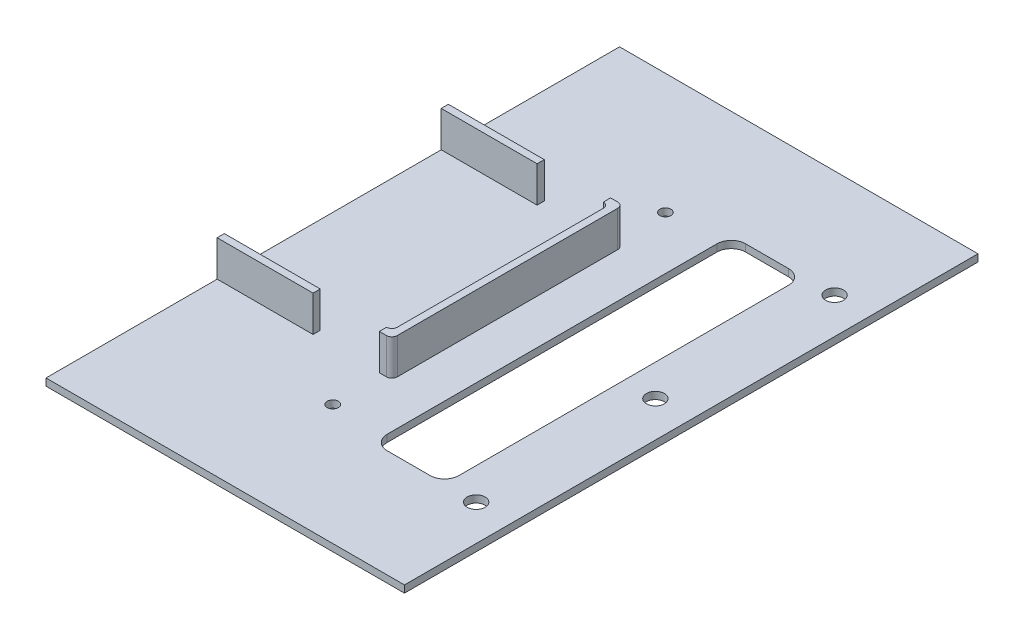
ISO-10303-21;
HEADER;
FILE_DESCRIPTION(('STEP AP214'),'2;1');
FILE_NAME('part.step','',(''),(''),'','','');
FILE_SCHEMA(('AUTOMOTIVE_DESIGN { 1 0 10303 214 1 1 1 1 }'));
ENDSEC;
DATA;
#1=APPLICATION_CONTEXT('core data for automotive mechanical design processes');
#2=APPLICATION_PROTOCOL_DEFINITION('international standard','automotive_design',2000,#1);
#3=PRODUCT_CONTEXT('',#1,'mechanical');
#4=PRODUCT('Part','Part','',(#3));
#5=PRODUCT_RELATED_PRODUCT_CATEGORY('part','',(#4));
#6=PRODUCT_DEFINITION_FORMATION('','',#4);
#7=PRODUCT_DEFINITION_CONTEXT('part definition',#1,'design');
#8=PRODUCT_DEFINITION('design','',#6,#7);
#9=PRODUCT_DEFINITION_SHAPE('','',#8);
#10=(LENGTH_UNIT() NAMED_UNIT(*) SI_UNIT(.MILLI.,.METRE.));
#11=(NAMED_UNIT(*) PLANE_ANGLE_UNIT() SI_UNIT($,.RADIAN.));
#12=(NAMED_UNIT(*) SI_UNIT($,.STERADIAN.) SOLID_ANGLE_UNIT());
#13=UNCERTAINTY_MEASURE_WITH_UNIT(LENGTH_MEASURE(1.E-05),#10,'distance_accuracy_value','');
#14=(GEOMETRIC_REPRESENTATION_CONTEXT(3) GLOBAL_UNCERTAINTY_ASSIGNED_CONTEXT((#13)) GLOBAL_UNIT_ASSIGNED_CONTEXT((#10,
#11,#12)) REPRESENTATION_CONTEXT('',''));
#15=CARTESIAN_POINT('',(0.,0.,0.));
#16=DIRECTION('',(0.,0.,1.));
#17=DIRECTION('',(1.,0.,0.));
#18=AXIS2_PLACEMENT_3D('',#15,#16,#17);
#19=CARTESIAN_POINT('',(0.,2.,0.));
#20=DIRECTION('',(0.,1.,0.));
#21=DIRECTION('',(0.,0.,1.));
#22=AXIS2_PLACEMENT_3D('',#19,#20,#21);
#23=PLANE('',#22);
#24=CARTESIAN_POINT('',(46.4,2.,46.4));
#25=DIRECTION('',(0.,1.,0.));
#26=DIRECTION('',(0.,0.,1.));
#27=AXIS2_PLACEMENT_3D('',#24,#25,#26);
#28=CIRCLE('',#27,1.55);
#29=CARTESIAN_POINT('',(46.4,2.,47.95));
#30=VERTEX_POINT('',#29);
#31=EDGE_CURVE('E622',#30,#30,#28,.F.);
#32=ORIENTED_EDGE('',*,*,#31,.T.);
#33=EDGE_LOOP('',(#32));
#34=FACE_BOUND('',#33,.T.);
#35=DIRECTION('',(1.,0.,0.));
#36=VECTOR('',#35,1.);
#37=CARTESIAN_POINT('',(0.,2.,-30.25));
#38=LINE('',#37,#36);
#39=CARTESIAN_POINT('',(0.,2.,-30.25));
#40=VERTEX_POINT('',#39);
#41=CARTESIAN_POINT('',(26.75,2.,-30.25));
#42=VERTEX_POINT('',#41);
#43=EDGE_CURVE('E288',#40,#42,#38,.T.);
#44=ORIENTED_EDGE('',*,*,#43,.F.);
#45=DIRECTION('',(0.,0.,1.));
#46=VECTOR('',#45,1.);
#47=CARTESIAN_POINT('',(0.,2.,0.));
#48=LINE('',#47,#46);
#49=CARTESIAN_POINT('',(0.,2.,30.25));
#50=VERTEX_POINT('',#49);
#51=EDGE_CURVE('E456',#40,#50,#48,.T.);
#52=ORIENTED_EDGE('',*,*,#51,.T.);
#53=DIRECTION('',(1.,0.,0.));
#54=VECTOR('',#53,1.);
#55=CARTESIAN_POINT('',(0.,2.,30.25));
#56=LINE('',#55,#54);
#57=CARTESIAN_POINT('',(26.75,2.,30.25));
#58=VERTEX_POINT('',#57);
#59=EDGE_CURVE('E325',#50,#58,#56,.T.);
#60=ORIENTED_EDGE('',*,*,#59,.T.);
#61=DIRECTION('',(0.,0.,-1.));
#62=VECTOR('',#61,1.);
#63=CARTESIAN_POINT('',(26.75,2.,0.));
#64=LINE('',#63,#62);
#65=CARTESIAN_POINT('',(26.75,2.,32.25));
#66=VERTEX_POINT('',#65);
#67=EDGE_CURVE('E71',#66,#58,#64,.T.);
#68=ORIENTED_EDGE('',*,*,#67,.F.);
#69=DIRECTION('',(1.,0.,0.));
#70=VECTOR('',#69,1.);
#71=CARTESIAN_POINT('',(0.,2.,32.25));
#72=LINE('',#71,#70);
#73=CARTESIAN_POINT('',(0.,2.,32.25));
#74=VERTEX_POINT('',#73);
#75=EDGE_CURVE('E273',#74,#66,#72,.T.);
#76=ORIENTED_EDGE('',*,*,#75,.F.);
#77=CARTESIAN_POINT('',(0.,2.,80.));
#78=VERTEX_POINT('',#77);
#79=EDGE_CURVE('E450',#74,#78,#48,.T.);
#80=ORIENTED_EDGE('',*,*,#79,.T.);
#81=DIRECTION('',(1.,0.,0.));
#82=VECTOR('',#81,1.);
#83=CARTESIAN_POINT('',(0.,2.,80.));
#84=LINE('',#83,#82);
#85=CARTESIAN_POINT('',(99.9999999999999,2.,80.));
#86=VERTEX_POINT('',#85);
#87=EDGE_CURVE('E455',#78,#86,#84,.T.);
#88=ORIENTED_EDGE('',*,*,#87,.T.);
#89=DIRECTION('',(0.,0.,-1.));
#90=VECTOR('',#89,1.);
#91=CARTESIAN_POINT('',(99.9999999999999,2.,0.));
#92=LINE('',#91,#90);
#93=CARTESIAN_POINT('',(99.9999999999999,2.,-80.));
#94=VERTEX_POINT('',#93);
#95=EDGE_CURVE('E459',#86,#94,#92,.T.);
#96=ORIENTED_EDGE('',*,*,#95,.T.);
#97=DIRECTION('',(-1.,0.,0.));
#98=VECTOR('',#97,1.);
#99=CARTESIAN_POINT('',(0.,2.,-80.));
#100=LINE('',#99,#98);
#101=CARTESIAN_POINT('',(0.,2.,-80.));
#102=VERTEX_POINT('',#101);
#103=EDGE_CURVE('E462',#94,#102,#100,.T.);
#104=ORIENTED_EDGE('',*,*,#103,.T.);
#105=CARTESIAN_POINT('',(0.,2.,-32.25));
#106=VERTEX_POINT('',#105);
#107=EDGE_CURVE('E451',#102,#106,#48,.T.);
#108=ORIENTED_EDGE('',*,*,#107,.T.);
#109=DIRECTION('',(1.,0.,0.));
#110=VECTOR('',#109,1.);
#111=CARTESIAN_POINT('',(0.,2.,-32.25));
#112=LINE('',#111,#110);
#113=CARTESIAN_POINT('',(26.75,2.,-32.25));
#114=VERTEX_POINT('',#113);
#115=EDGE_CURVE('E301',#106,#114,#112,.T.);
#116=ORIENTED_EDGE('',*,*,#115,.T.);
#117=DIRECTION('',(0.,0.,1.));
#118=VECTOR('',#117,1.);
#119=CARTESIAN_POINT('',(26.75,2.,0.));
#120=LINE('',#119,#118);
#121=EDGE_CURVE('E63',#114,#42,#120,.T.);
#122=ORIENTED_EDGE('',*,*,#121,.T.);
#123=EDGE_LOOP('',(#44,#52,#60,#68,#76,#80,#88,#96,#104,#108,#116,#122));
#124=FACE_BOUND('',#123,.T.);
#125=CARTESIAN_POINT('',(90.0000000000001,2.,-50.));
#126=DIRECTION('',(0.,1.,0.));
#127=DIRECTION('',(0.,0.,1.));
#128=AXIS2_PLACEMENT_3D('',#125,#126,#127);
#129=CIRCLE('',#128,2.49999999999999);
#130=CARTESIAN_POINT('',(90.0000000000001,2.,-47.5));
#131=VERTEX_POINT('',#130);
#132=EDGE_CURVE('E465',#131,#131,#129,.F.);
#133=ORIENTED_EDGE('',*,*,#132,.T.);
#134=EDGE_LOOP('',(#133));
#135=FACE_BOUND('',#134,.T.);
#136=CARTESIAN_POINT('',(90.0000000000001,2.,50.));
#137=DIRECTION('',(0.,1.,0.));
#138=DIRECTION('',(0.,0.,1.));
#139=AXIS2_PLACEMENT_3D('',#136,#137,#138);
#140=CIRCLE('',#139,2.49999999999999);
#141=CARTESIAN_POINT('',(90.0000000000001,2.,52.5));
#142=VERTEX_POINT('',#141);
#143=EDGE_CURVE('E445',#142,#142,#140,.T.);
#144=ORIENTED_EDGE('',*,*,#143,.F.);
#145=EDGE_LOOP('',(#144));
#146=FACE_BOUND('',#145,.T.);
#147=CARTESIAN_POINT('',(90.,2.,0.));
#148=DIRECTION('',(0.,1.,0.));
#149=DIRECTION('',(0.,0.,1.));
#150=AXIS2_PLACEMENT_3D('',#147,#148,#149);
#151=CIRCLE('',#150,2.5);
#152=CARTESIAN_POINT('',(90.,2.,2.49999999999998));
#153=VERTEX_POINT('',#152);
#154=EDGE_CURVE('E441',#153,#153,#151,.F.);
#155=ORIENTED_EDGE('',*,*,#154,.T.);
#156=EDGE_LOOP('',(#155));
#157=FACE_BOUND('',#156,.T.);
#158=CARTESIAN_POINT('',(65.1780185217295,2.,-46.));
#159=DIRECTION('',(0.,1.,0.));
#160=DIRECTION('',(0.,0.,1.));
#161=AXIS2_PLACEMENT_3D('',#158,#159,#160);
#162=CIRCLE('',#161,4.);
#163=CARTESIAN_POINT('',(65.1780185217295,2.,-50.));
#164=VERTEX_POINT('',#163);
#165=CARTESIAN_POINT('',(61.1780185217295,2.,-46.));
#166=VERTEX_POINT('',#165);
#167=EDGE_CURVE('E389',#164,#166,#162,.T.);
#168=ORIENTED_EDGE('',*,*,#167,.F.);
#169=DIRECTION('',(1.,0.,0.));
#170=VECTOR('',#169,1.);
#171=CARTESIAN_POINT('',(0.,2.,-50.));
#172=LINE('',#171,#170);
#173=CARTESIAN_POINT('',(77.1780185217294,2.,-50.));
#174=VERTEX_POINT('',#173);
#175=EDGE_CURVE('E354',#164,#174,#172,.T.);
#176=ORIENTED_EDGE('',*,*,#175,.T.);
#177=CARTESIAN_POINT('',(77.1780185217295,2.,-46.));
#178=DIRECTION('',(0.,1.,0.));
#179=DIRECTION('',(0.,0.,1.));
#180=AXIS2_PLACEMENT_3D('',#177,#178,#179);
#181=CIRCLE('',#180,4.);
#182=CARTESIAN_POINT('',(81.1780185217295,2.,-46.));
#183=VERTEX_POINT('',#182);
#184=EDGE_CURVE('E359',#183,#174,#181,.T.);
#185=ORIENTED_EDGE('',*,*,#184,.F.);
#186=DIRECTION('',(0.,0.,1.));
#187=VECTOR('',#186,1.);
#188=CARTESIAN_POINT('',(81.1780185217295,2.,0.));
#189=LINE('',#188,#187);
#190=CARTESIAN_POINT('',(81.1780185217295,2.,46.));
#191=VERTEX_POINT('',#190);
#192=EDGE_CURVE('E409',#183,#191,#189,.T.);
#193=ORIENTED_EDGE('',*,*,#192,.T.);
#194=CARTESIAN_POINT('',(77.1780185217295,2.,46.));
#195=DIRECTION('',(0.,1.,0.));
#196=DIRECTION('',(0.,0.,1.));
#197=AXIS2_PLACEMENT_3D('',#194,#195,#196);
#198=CIRCLE('',#197,4.);
#199=CARTESIAN_POINT('',(77.1780185217294,2.,50.));
#200=VERTEX_POINT('',#199);
#201=EDGE_CURVE('E405',#200,#191,#198,.T.);
#202=ORIENTED_EDGE('',*,*,#201,.F.);
#203=DIRECTION('',(1.,0.,0.));
#204=VECTOR('',#203,1.);
#205=CARTESIAN_POINT('',(0.,2.,50.));
#206=LINE('',#205,#204);
#207=CARTESIAN_POINT('',(65.1780185217295,2.,50.));
#208=VERTEX_POINT('',#207);
#209=EDGE_CURVE('E401',#208,#200,#206,.T.);
#210=ORIENTED_EDGE('',*,*,#209,.F.);
#211=CARTESIAN_POINT('',(65.1780185217295,2.,46.));
#212=DIRECTION('',(0.,1.,0.));
#213=DIRECTION('',(0.,0.,1.));
#214=AXIS2_PLACEMENT_3D('',#211,#212,#213);
#215=CIRCLE('',#214,4.);
#216=CARTESIAN_POINT('',(61.1780185217295,2.,46.));
#217=VERTEX_POINT('',#216);
#218=EDGE_CURVE('E397',#208,#217,#215,.F.);
#219=ORIENTED_EDGE('',*,*,#218,.T.);
#220=DIRECTION('',(0.,0.,1.));
#221=VECTOR('',#220,1.);
#222=CARTESIAN_POINT('',(61.1780185217295,2.,0.));
#223=LINE('',#222,#221);
#224=EDGE_CURVE('E393',#166,#217,#223,.T.);
#225=ORIENTED_EDGE('',*,*,#224,.F.);
#226=EDGE_LOOP('',(#168,#176,#185,#193,#202,#210,#219,#225));
#227=FACE_BOUND('',#226,.T.);
#228=CARTESIAN_POINT('',(47.25,2.,30.75));
#229=DIRECTION('',(0.,1.,0.));
#230=DIRECTION('',(0.,0.,1.));
#231=AXIS2_PLACEMENT_3D('',#228,#229,#230);
#232=CIRCLE('',#231,1.5);
#233=CARTESIAN_POINT('',(47.25,2.,32.25));
#234=VERTEX_POINT('',#233);
#235=CARTESIAN_POINT('',(48.75,2.,30.75));
#236=VERTEX_POINT('',#235);
#237=EDGE_CURVE('E609',#234,#236,#232,.T.);
#238=ORIENTED_EDGE('',*,*,#237,.F.);
#239=DIRECTION('',(1.,0.,0.));
#240=VECTOR('',#239,1.);
#241=CARTESIAN_POINT('',(0.,2.,32.25));
#242=LINE('',#241,#240);
#243=CARTESIAN_POINT('',(45.25,2.,32.25));
#244=VERTEX_POINT('',#243);
#245=EDGE_CURVE('E270',#244,#234,#242,.T.);
#246=ORIENTED_EDGE('',*,*,#245,.F.);
#247=DIRECTION('',(0.,0.,1.));
#248=VECTOR('',#247,1.);
#249=CARTESIAN_POINT('',(45.25,2.,0.));
#250=LINE('',#249,#248);
#251=CARTESIAN_POINT('',(45.25,2.,30.25));
#252=VERTEX_POINT('',#251);
#253=EDGE_CURVE('E266',#252,#244,#250,.T.);
#254=ORIENTED_EDGE('',*,*,#253,.F.);
#255=CARTESIAN_POINT('',(45.25,2.,28.75));
#256=DIRECTION('',(0.,1.,0.));
#257=DIRECTION('',(0.,0.,1.));
#258=AXIS2_PLACEMENT_3D('',#255,#256,#257);
#259=CIRCLE('',#258,1.5);
#260=CARTESIAN_POINT('',(46.75,2.,28.75));
#261=VERTEX_POINT('',#260);
#262=EDGE_CURVE('E680',#261,#252,#259,.F.);
#263=ORIENTED_EDGE('',*,*,#262,.F.);
#264=DIRECTION('',(0.,0.,-1.));
#265=VECTOR('',#264,1.);
#266=CARTESIAN_POINT('',(46.75,2.,0.));
#267=LINE('',#266,#265);
#268=CARTESIAN_POINT('',(46.75,2.,-28.75));
#269=VERTEX_POINT('',#268);
#270=EDGE_CURVE('E676',#261,#269,#267,.T.);
#271=ORIENTED_EDGE('',*,*,#270,.T.);
#272=CARTESIAN_POINT('',(45.25,2.,-28.75));
#273=DIRECTION('',(0.,1.,0.));
#274=DIRECTION('',(0.,0.,1.));
#275=AXIS2_PLACEMENT_3D('',#272,#273,#274);
#276=CIRCLE('',#275,1.5);
#277=CARTESIAN_POINT('',(45.25,2.,-30.25));
#278=VERTEX_POINT('',#277);
#279=EDGE_CURVE('E672',#278,#269,#276,.F.);
#280=ORIENTED_EDGE('',*,*,#279,.F.);
#281=DIRECTION('',(0.,0.,-1.));
#282=VECTOR('',#281,1.);
#283=CARTESIAN_POINT('',(45.25,2.,0.));
#284=LINE('',#283,#282);
#285=CARTESIAN_POINT('',(45.25,2.,-32.25));
#286=VERTEX_POINT('',#285);
#287=EDGE_CURVE('E668',#278,#286,#284,.T.);
#288=ORIENTED_EDGE('',*,*,#287,.T.);
#289=DIRECTION('',(1.,0.,0.));
#290=VECTOR('',#289,1.);
#291=CARTESIAN_POINT('',(0.,2.,-32.25));
#292=LINE('',#291,#290);
#293=CARTESIAN_POINT('',(47.25,2.,-32.25));
#294=VERTEX_POINT('',#293);
#295=EDGE_CURVE('E664',#286,#294,#292,.T.);
#296=ORIENTED_EDGE('',*,*,#295,.T.);
#297=CARTESIAN_POINT('',(47.25,2.,-30.75));
#298=DIRECTION('',(0.,1.,0.));
#299=DIRECTION('',(0.,0.,1.));
#300=AXIS2_PLACEMENT_3D('',#297,#298,#299);
#301=CIRCLE('',#300,1.5);
#302=CARTESIAN_POINT('',(48.75,2.,-30.75));
#303=VERTEX_POINT('',#302);
#304=EDGE_CURVE('E660',#303,#294,#301,.T.);
#305=ORIENTED_EDGE('',*,*,#304,.F.);
#306=DIRECTION('',(0.,0.,-1.));
#307=VECTOR('',#306,1.);
#308=CARTESIAN_POINT('',(48.75,2.,0.));
#309=LINE('',#308,#307);
#310=EDGE_CURVE('E657',#236,#303,#309,.T.);
#311=ORIENTED_EDGE('',*,*,#310,.F.);
#312=EDGE_LOOP('',(#238,#246,#254,#263,#271,#280,#288,#296,#305,#311));
#313=FACE_BOUND('',#312,.T.);
#314=CARTESIAN_POINT('',(46.4,2.,-46.4));
#315=DIRECTION('',(0.,1.,0.));
#316=DIRECTION('',(0.,0.,1.));
#317=AXIS2_PLACEMENT_3D('',#314,#315,#316);
#318=CIRCLE('',#317,1.55);
#319=CARTESIAN_POINT('',(46.4,2.,-44.85));
#320=VERTEX_POINT('',#319);
#321=EDGE_CURVE('E612',#320,#320,#318,.T.);
#322=ORIENTED_EDGE('',*,*,#321,.F.);
#323=EDGE_LOOP('',(#322));
#324=FACE_BOUND('',#323,.T.);
#325=ADVANCED_FACE('F47',(#34,#124,#135,#146,#157,#227,#313,#324),#23,.T.);
#326=CARTESIAN_POINT('',(0.,0.,0.));
#327=DIRECTION('',(0.,1.,0.));
#328=DIRECTION('',(0.,0.,1.));
#329=AXIS2_PLACEMENT_3D('',#326,#327,#328);
#330=PLANE('',#329);
#331=DIRECTION('',(1.,0.,0.));
#332=VECTOR('',#331,1.);
#333=CARTESIAN_POINT('',(0.,0.,-50.));
#334=LINE('',#333,#332);
#335=CARTESIAN_POINT('',(65.1780185217295,0.,-50.));
#336=VERTEX_POINT('',#335);
#337=CARTESIAN_POINT('',(77.1780185217294,0.,-50.));
#338=VERTEX_POINT('',#337);
#339=EDGE_CURVE('E355',#336,#338,#334,.T.);
#340=ORIENTED_EDGE('',*,*,#339,.F.);
#341=CARTESIAN_POINT('',(65.1780185217295,0.,-46.));
#342=DIRECTION('',(0.,1.,0.));
#343=DIRECTION('',(0.,0.,1.));
#344=AXIS2_PLACEMENT_3D('',#341,#342,#343);
#345=CIRCLE('',#344,4.);
#346=CARTESIAN_POINT('',(61.1780185217295,0.,-46.));
#347=VERTEX_POINT('',#346);
#348=EDGE_CURVE('E358',#336,#347,#345,.T.);
#349=ORIENTED_EDGE('',*,*,#348,.T.);
#350=DIRECTION('',(0.,0.,1.));
#351=VECTOR('',#350,1.);
#352=CARTESIAN_POINT('',(61.1780185217295,0.,0.));
#353=LINE('',#352,#351);
#354=CARTESIAN_POINT('',(61.1780185217295,0.,46.));
#355=VERTEX_POINT('',#354);
#356=EDGE_CURVE('E363',#347,#355,#353,.T.);
#357=ORIENTED_EDGE('',*,*,#356,.T.);
#358=CARTESIAN_POINT('',(65.1780185217295,0.,46.));
#359=DIRECTION('',(0.,1.,0.));
#360=DIRECTION('',(0.,0.,1.));
#361=AXIS2_PLACEMENT_3D('',#358,#359,#360);
#362=CIRCLE('',#361,4.);
#363=CARTESIAN_POINT('',(65.1780185217295,0.,50.));
#364=VERTEX_POINT('',#363);
#365=EDGE_CURVE('E367',#364,#355,#362,.F.);
#366=ORIENTED_EDGE('',*,*,#365,.F.);
#367=DIRECTION('',(1.,0.,0.));
#368=VECTOR('',#367,1.);
#369=CARTESIAN_POINT('',(0.,0.,50.));
#370=LINE('',#369,#368);
#371=CARTESIAN_POINT('',(77.1780185217294,0.,50.));
#372=VERTEX_POINT('',#371);
#373=EDGE_CURVE('E370',#364,#372,#370,.T.);
#374=ORIENTED_EDGE('',*,*,#373,.T.);
#375=CARTESIAN_POINT('',(77.1780185217295,0.,46.));
#376=DIRECTION('',(0.,1.,0.));
#377=DIRECTION('',(0.,0.,1.));
#378=AXIS2_PLACEMENT_3D('',#375,#376,#377);
#379=CIRCLE('',#378,4.);
#380=CARTESIAN_POINT('',(81.1780185217295,0.,46.));
#381=VERTEX_POINT('',#380);
#382=EDGE_CURVE('E374',#372,#381,#379,.T.);
#383=ORIENTED_EDGE('',*,*,#382,.T.);
#384=DIRECTION('',(0.,0.,1.));
#385=VECTOR('',#384,1.);
#386=CARTESIAN_POINT('',(81.1780185217295,0.,0.));
#387=LINE('',#386,#385);
#388=CARTESIAN_POINT('',(81.1780185217295,0.,-46.));
#389=VERTEX_POINT('',#388);
#390=EDGE_CURVE('E378',#389,#381,#387,.T.);
#391=ORIENTED_EDGE('',*,*,#390,.F.);
#392=CARTESIAN_POINT('',(77.1780185217295,0.,-46.));
#393=DIRECTION('',(0.,1.,0.));
#394=DIRECTION('',(0.,0.,1.));
#395=AXIS2_PLACEMENT_3D('',#392,#393,#394);
#396=CIRCLE('',#395,4.);
#397=EDGE_CURVE('E381',#389,#338,#396,.T.);
#398=ORIENTED_EDGE('',*,*,#397,.T.);
#399=EDGE_LOOP('',(#340,#349,#357,#366,#374,#383,#391,#398));
#400=FACE_BOUND('',#399,.T.);
#401=CARTESIAN_POINT('',(90.,0.,0.));
#402=DIRECTION('',(0.,1.,0.));
#403=DIRECTION('',(0.,0.,1.));
#404=AXIS2_PLACEMENT_3D('',#401,#402,#403);
#405=CIRCLE('',#404,2.5);
#406=CARTESIAN_POINT('',(90.,0.,2.49999999999998));
#407=VERTEX_POINT('',#406);
#408=EDGE_CURVE('E419',#407,#407,#405,.F.);
#409=ORIENTED_EDGE('',*,*,#408,.F.);
#410=EDGE_LOOP('',(#409));
#411=FACE_BOUND('',#410,.T.);
#412=CARTESIAN_POINT('',(90.0000000000001,0.,50.));
#413=DIRECTION('',(0.,1.,0.));
#414=DIRECTION('',(0.,0.,1.));
#415=AXIS2_PLACEMENT_3D('',#412,#413,#414);
#416=CIRCLE('',#415,2.49999999999999);
#417=CARTESIAN_POINT('',(90.0000000000001,0.,52.5));
#418=VERTEX_POINT('',#417);
#419=EDGE_CURVE('E473',#418,#418,#416,.T.);
#420=ORIENTED_EDGE('',*,*,#419,.T.);
#421=EDGE_LOOP('',(#420));
#422=FACE_BOUND('',#421,.T.);
#423=DIRECTION('',(0.,0.,1.));
#424=VECTOR('',#423,1.);
#425=CARTESIAN_POINT('',(0.,0.,0.));
#426=LINE('',#425,#424);
#427=CARTESIAN_POINT('',(0.,0.,-80.));
#428=VERTEX_POINT('',#427);
#429=CARTESIAN_POINT('',(0.,0.,80.));
#430=VERTEX_POINT('',#429);
#431=EDGE_CURVE('E477',#428,#430,#426,.T.);
#432=ORIENTED_EDGE('',*,*,#431,.F.);
#433=DIRECTION('',(-1.,0.,0.));
#434=VECTOR('',#433,1.);
#435=CARTESIAN_POINT('',(0.,0.,-80.));
#436=LINE('',#435,#434);
#437=CARTESIAN_POINT('',(99.9999999999999,0.,-80.));
#438=VERTEX_POINT('',#437);
#439=EDGE_CURVE('E487',#438,#428,#436,.T.);
#440=ORIENTED_EDGE('',*,*,#439,.F.);
#441=DIRECTION('',(0.,0.,-1.));
#442=VECTOR('',#441,1.);
#443=CARTESIAN_POINT('',(99.9999999999999,0.,0.));
#444=LINE('',#443,#442);
#445=CARTESIAN_POINT('',(99.9999999999999,0.,80.));
#446=VERTEX_POINT('',#445);
#447=EDGE_CURVE('E484',#446,#438,#444,.T.);
#448=ORIENTED_EDGE('',*,*,#447,.F.);
#449=DIRECTION('',(1.,0.,0.));
#450=VECTOR('',#449,1.);
#451=CARTESIAN_POINT('',(0.,0.,80.));
#452=LINE('',#451,#450);
#453=EDGE_CURVE('E481',#430,#446,#452,.T.);
#454=ORIENTED_EDGE('',*,*,#453,.F.);
#455=EDGE_LOOP('',(#432,#440,#448,#454));
#456=FACE_BOUND('',#455,.T.);
#457=CARTESIAN_POINT('',(90.0000000000001,0.,-50.));
#458=DIRECTION('',(0.,1.,0.));
#459=DIRECTION('',(0.,0.,1.));
#460=AXIS2_PLACEMENT_3D('',#457,#458,#459);
#461=CIRCLE('',#460,2.49999999999999);
#462=CARTESIAN_POINT('',(90.0000000000001,0.,-47.5));
#463=VERTEX_POINT('',#462);
#464=EDGE_CURVE('E446',#463,#463,#461,.F.);
#465=ORIENTED_EDGE('',*,*,#464,.F.);
#466=EDGE_LOOP('',(#465));
#467=FACE_BOUND('',#466,.T.);
#468=CARTESIAN_POINT('',(46.4,0.,46.4));
#469=DIRECTION('',(0.,1.,0.));
#470=DIRECTION('',(0.,0.,1.));
#471=AXIS2_PLACEMENT_3D('',#468,#469,#470);
#472=CIRCLE('',#471,1.55);
#473=CARTESIAN_POINT('',(46.4,0.,47.95));
#474=VERTEX_POINT('',#473);
#475=EDGE_CURVE('E615',#474,#474,#472,.F.);
#476=ORIENTED_EDGE('',*,*,#475,.F.);
#477=EDGE_LOOP('',(#476));
#478=FACE_BOUND('',#477,.T.);
#479=CARTESIAN_POINT('',(46.4,0.,-46.4));
#480=DIRECTION('',(0.,1.,0.));
#481=DIRECTION('',(0.,0.,1.));
#482=AXIS2_PLACEMENT_3D('',#479,#480,#481);
#483=CIRCLE('',#482,1.55);
#484=CARTESIAN_POINT('',(46.4,0.,-44.85));
#485=VERTEX_POINT('',#484);
#486=EDGE_CURVE('E302',#485,#485,#483,.T.);
#487=ORIENTED_EDGE('',*,*,#486,.T.);
#488=EDGE_LOOP('',(#487));
#489=FACE_BOUND('',#488,.T.);
#490=ADVANCED_FACE('F512',(#400,#411,#422,#456,#467,#478,#489),#330,.F.);
#491=CARTESIAN_POINT('',(0.,2.,0.));
#492=DIRECTION('',(1.,0.,0.));
#493=DIRECTION('',(0.,0.,-1.));
#494=AXIS2_PLACEMENT_3D('',#491,#492,#493);
#495=PLANE('',#494);
#496=ORIENTED_EDGE('',*,*,#431,.T.);
#497=DIRECTION('',(0.,-1.,0.));
#498=VECTOR('',#497,1.);
#499=CARTESIAN_POINT('',(0.,2.,80.));
#500=LINE('',#499,#498);
#501=EDGE_CURVE('E11',#78,#430,#500,.T.);
#502=ORIENTED_EDGE('',*,*,#501,.F.);
#503=ORIENTED_EDGE('',*,*,#79,.F.);
#504=DIRECTION('',(0.,-1.,0.));
#505=VECTOR('',#504,1.);
#506=CARTESIAN_POINT('',(0.,12.,32.25));
#507=LINE('',#506,#505);
#508=CARTESIAN_POINT('',(0.,12.,32.25));
#509=VERTEX_POINT('',#508);
#510=EDGE_CURVE('E334',#509,#74,#507,.T.);
#511=ORIENTED_EDGE('',*,*,#510,.F.);
#512=DIRECTION('',(0.,0.,1.));
#513=VECTOR('',#512,1.);
#514=CARTESIAN_POINT('',(0.,12.,0.));
#515=LINE('',#514,#513);
#516=CARTESIAN_POINT('',(0.,12.,30.25));
#517=VERTEX_POINT('',#516);
#518=EDGE_CURVE('E332',#517,#509,#515,.T.);
#519=ORIENTED_EDGE('',*,*,#518,.F.);
#520=DIRECTION('',(0.,-1.,0.));
#521=VECTOR('',#520,1.);
#522=CARTESIAN_POINT('',(0.,12.,30.25));
#523=LINE('',#522,#521);
#524=EDGE_CURVE('E343',#517,#50,#523,.T.);
#525=ORIENTED_EDGE('',*,*,#524,.T.);
#526=ORIENTED_EDGE('',*,*,#51,.F.);
#527=DIRECTION('',(0.,-1.,0.));
#528=VECTOR('',#527,1.);
#529=CARTESIAN_POINT('',(0.,12.,-30.25));
#530=LINE('',#529,#528);
#531=CARTESIAN_POINT('',(0.,12.,-30.25));
#532=VERTEX_POINT('',#531);
#533=EDGE_CURVE('E311',#532,#40,#530,.T.);
#534=ORIENTED_EDGE('',*,*,#533,.F.);
#535=DIRECTION('',(0.,0.,1.));
#536=VECTOR('',#535,1.);
#537=CARTESIAN_POINT('',(0.,12.,0.));
#538=LINE('',#537,#536);
#539=CARTESIAN_POINT('',(0.,12.,-32.25));
#540=VERTEX_POINT('',#539);
#541=EDGE_CURVE('E292',#540,#532,#538,.T.);
#542=ORIENTED_EDGE('',*,*,#541,.F.);
#543=DIRECTION('',(0.,-1.,0.));
#544=VECTOR('',#543,1.);
#545=CARTESIAN_POINT('',(0.,12.,-32.25));
#546=LINE('',#545,#544);
#547=EDGE_CURVE('E314',#540,#106,#546,.T.);
#548=ORIENTED_EDGE('',*,*,#547,.T.);
#549=ORIENTED_EDGE('',*,*,#107,.F.);
#550=DIRECTION('',(0.,-1.,0.));
#551=VECTOR('',#550,1.);
#552=CARTESIAN_POINT('',(0.,2.,-80.));
#553=LINE('',#552,#551);
#554=EDGE_CURVE('E469',#102,#428,#553,.T.);
#555=ORIENTED_EDGE('',*,*,#554,.T.);
#556=EDGE_LOOP('',(#496,#502,#503,#511,#519,#525,#526,#534,#542,#548,#549,#555));
#557=FACE_BOUND('',#556,.T.);
#558=ADVANCED_FACE('F520',(#557),#495,.F.);
#559=CARTESIAN_POINT('',(0.,2.,80.));
#560=DIRECTION('',(0.,0.,-1.));
#561=DIRECTION('',(-1.,0.,0.));
#562=AXIS2_PLACEMENT_3D('',#559,#560,#561);
#563=PLANE('',#562);
#564=ORIENTED_EDGE('',*,*,#453,.T.);
#565=DIRECTION('',(0.,-1.,0.));
#566=VECTOR('',#565,1.);
#567=CARTESIAN_POINT('',(99.9999999999999,2.,80.));
#568=LINE('',#567,#566);
#569=EDGE_CURVE('E56',#86,#446,#568,.T.);
#570=ORIENTED_EDGE('',*,*,#569,.F.);
#571=ORIENTED_EDGE('',*,*,#87,.F.);
#572=ORIENTED_EDGE('',*,*,#501,.T.);
#573=EDGE_LOOP('',(#564,#570,#571,#572));
#574=FACE_BOUND('',#573,.T.);
#575=ADVANCED_FACE('F527',(#574),#563,.F.);
#576=CARTESIAN_POINT('',(99.9999999999999,2.,0.));
#577=DIRECTION('',(-1.,0.,0.));
#578=DIRECTION('',(0.,0.,1.));
#579=AXIS2_PLACEMENT_3D('',#576,#577,#578);
#580=PLANE('',#579);
#581=ORIENTED_EDGE('',*,*,#447,.T.);
#582=DIRECTION('',(0.,-1.,0.));
#583=VECTOR('',#582,1.);
#584=CARTESIAN_POINT('',(99.9999999999999,2.,-80.));
#585=LINE('',#584,#583);
#586=EDGE_CURVE('E496',#94,#438,#585,.T.);
#587=ORIENTED_EDGE('',*,*,#586,.F.);
#588=ORIENTED_EDGE('',*,*,#95,.F.);
#589=ORIENTED_EDGE('',*,*,#569,.T.);
#590=EDGE_LOOP('',(#581,#587,#588,#589));
#591=FACE_BOUND('',#590,.T.);
#592=ADVANCED_FACE('F505',(#591),#580,.F.);
#593=CARTESIAN_POINT('',(0.,2.,-80.));
#594=DIRECTION('',(0.,0.,1.));
#595=DIRECTION('',(1.,0.,0.));
#596=AXIS2_PLACEMENT_3D('',#593,#594,#595);
#597=PLANE('',#596);
#598=ORIENTED_EDGE('',*,*,#439,.T.);
#599=ORIENTED_EDGE('',*,*,#554,.F.);
#600=ORIENTED_EDGE('',*,*,#103,.F.);
#601=ORIENTED_EDGE('',*,*,#586,.T.);
#602=EDGE_LOOP('',(#598,#599,#600,#601));
#603=FACE_BOUND('',#602,.T.);
#604=ADVANCED_FACE('F516',(#603),#597,.F.);
#605=CARTESIAN_POINT('',(90.0000000000001,2.,50.));
#606=DIRECTION('',(0.,-1.,0.));
#607=DIRECTION('',(0.,0.,-1.));
#608=AXIS2_PLACEMENT_3D('',#605,#606,#607);
#609=CYLINDRICAL_SURFACE('',#608,2.49999999999999);
#610=ORIENTED_EDGE('',*,*,#143,.T.);
#611=EDGE_LOOP('',(#610));
#612=FACE_BOUND('',#611,.T.);
#613=ORIENTED_EDGE('',*,*,#419,.F.);
#614=EDGE_LOOP('',(#613));
#615=FACE_BOUND('',#614,.T.);
#616=ADVANCED_FACE('F584',(#612,#615),#609,.F.);
#617=CARTESIAN_POINT('',(90.,2.,0.));
#618=DIRECTION('',(0.,-1.,0.));
#619=DIRECTION('',(0.,0.,-1.));
#620=AXIS2_PLACEMENT_3D('',#617,#618,#619);
#621=CYLINDRICAL_SURFACE('',#620,2.5);
#622=ORIENTED_EDGE('',*,*,#154,.F.);
#623=EDGE_LOOP('',(#622));
#624=FACE_BOUND('',#623,.T.);
#625=ORIENTED_EDGE('',*,*,#408,.T.);
#626=EDGE_LOOP('',(#625));
#627=FACE_BOUND('',#626,.T.);
#628=ADVANCED_FACE('F49',(#624,#627),#621,.F.);
#629=CARTESIAN_POINT('',(90.0000000000001,2.,-50.));
#630=DIRECTION('',(0.,-1.,0.));
#631=DIRECTION('',(0.,0.,-1.));
#632=AXIS2_PLACEMENT_3D('',#629,#630,#631);
#633=CYLINDRICAL_SURFACE('',#632,2.49999999999999);
#634=ORIENTED_EDGE('',*,*,#132,.F.);
#635=EDGE_LOOP('',(#634));
#636=FACE_BOUND('',#635,.T.);
#637=ORIENTED_EDGE('',*,*,#464,.T.);
#638=EDGE_LOOP('',(#637));
#639=FACE_BOUND('',#638,.T.);
#640=ADVANCED_FACE('F578',(#636,#639),#633,.F.);
#641=CARTESIAN_POINT('',(0.,0.,-50.));
#642=DIRECTION('',(0.,0.,1.));
#643=DIRECTION('',(1.,0.,0.));
#644=AXIS2_PLACEMENT_3D('',#641,#642,#643);
#645=PLANE('',#644);
#646=ORIENTED_EDGE('',*,*,#175,.F.);
#647=DIRECTION('',(0.,1.,0.));
#648=VECTOR('',#647,1.);
#649=CARTESIAN_POINT('',(65.1780185217295,0.,-50.));
#650=LINE('',#649,#648);
#651=EDGE_CURVE('E385',#336,#164,#650,.T.);
#652=ORIENTED_EDGE('',*,*,#651,.F.);
#653=ORIENTED_EDGE('',*,*,#339,.T.);
#654=DIRECTION('',(0.,1.,0.));
#655=VECTOR('',#654,1.);
#656=CARTESIAN_POINT('',(77.1780185217294,0.,-50.));
#657=LINE('',#656,#655);
#658=EDGE_CURVE('E416',#338,#174,#657,.T.);
#659=ORIENTED_EDGE('',*,*,#658,.T.);
#660=EDGE_LOOP('',(#646,#652,#653,#659));
#661=FACE_BOUND('',#660,.T.);
#662=ADVANCED_FACE('F575',(#661),#645,.T.);
#663=CARTESIAN_POINT('',(77.1780185217295,0.,-46.));
#664=DIRECTION('',(0.,1.,0.));
#665=DIRECTION('',(0.,0.,1.));
#666=AXIS2_PLACEMENT_3D('',#663,#664,#665);
#667=CYLINDRICAL_SURFACE('',#666,4.);
#668=ORIENTED_EDGE('',*,*,#184,.T.);
#669=ORIENTED_EDGE('',*,*,#658,.F.);
#670=ORIENTED_EDGE('',*,*,#397,.F.);
#671=DIRECTION('',(0.,1.,0.));
#672=VECTOR('',#671,1.);
#673=CARTESIAN_POINT('',(81.1780185217295,0.,-46.));
#674=LINE('',#673,#672);
#675=EDGE_CURVE('E420',#389,#183,#674,.T.);
#676=ORIENTED_EDGE('',*,*,#675,.T.);
#677=EDGE_LOOP('',(#668,#669,#670,#676));
#678=FACE_BOUND('',#677,.T.);
#679=ADVANCED_FACE('F984',(#678),#667,.F.);
#680=CARTESIAN_POINT('',(81.1780185217295,0.,0.));
#681=DIRECTION('',(-1.,0.,0.));
#682=DIRECTION('',(0.,0.,1.));
#683=AXIS2_PLACEMENT_3D('',#680,#681,#682);
#684=PLANE('',#683);
#685=ORIENTED_EDGE('',*,*,#192,.F.);
#686=ORIENTED_EDGE('',*,*,#675,.F.);
#687=ORIENTED_EDGE('',*,*,#390,.T.);
#688=DIRECTION('',(0.,1.,0.));
#689=VECTOR('',#688,1.);
#690=CARTESIAN_POINT('',(81.1780185217295,0.,46.));
#691=LINE('',#690,#689);
#692=EDGE_CURVE('E423',#381,#191,#691,.T.);
#693=ORIENTED_EDGE('',*,*,#692,.T.);
#694=EDGE_LOOP('',(#685,#686,#687,#693));
#695=FACE_BOUND('',#694,.T.);
#696=ADVANCED_FACE('F974',(#695),#684,.T.);
#697=CARTESIAN_POINT('',(77.1780185217295,0.,46.));
#698=DIRECTION('',(0.,1.,0.));
#699=DIRECTION('',(0.,0.,1.));
#700=AXIS2_PLACEMENT_3D('',#697,#698,#699);
#701=CYLINDRICAL_SURFACE('',#700,4.);
#702=ORIENTED_EDGE('',*,*,#201,.T.);
#703=ORIENTED_EDGE('',*,*,#692,.F.);
#704=ORIENTED_EDGE('',*,*,#382,.F.);
#705=DIRECTION('',(0.,1.,0.));
#706=VECTOR('',#705,1.);
#707=CARTESIAN_POINT('',(77.1780185217294,0.,50.));
#708=LINE('',#707,#706);
#709=EDGE_CURVE('E426',#372,#200,#708,.T.);
#710=ORIENTED_EDGE('',*,*,#709,.T.);
#711=EDGE_LOOP('',(#702,#703,#704,#710));
#712=FACE_BOUND('',#711,.T.);
#713=ADVANCED_FACE('F965',(#712),#701,.F.);
#714=CARTESIAN_POINT('',(0.,0.,50.));
#715=DIRECTION('',(0.,0.,1.));
#716=DIRECTION('',(1.,0.,0.));
#717=AXIS2_PLACEMENT_3D('',#714,#715,#716);
#718=PLANE('',#717);
#719=ORIENTED_EDGE('',*,*,#209,.T.);
#720=ORIENTED_EDGE('',*,*,#709,.F.);
#721=ORIENTED_EDGE('',*,*,#373,.F.);
#722=DIRECTION('',(0.,1.,0.));
#723=VECTOR('',#722,1.);
#724=CARTESIAN_POINT('',(65.1780185217295,0.,50.));
#725=LINE('',#724,#723);
#726=EDGE_CURVE('E429',#364,#208,#725,.T.);
#727=ORIENTED_EDGE('',*,*,#726,.T.);
#728=EDGE_LOOP('',(#719,#720,#721,#727));
#729=FACE_BOUND('',#728,.T.);
#730=ADVANCED_FACE('F955',(#729),#718,.F.);
#731=CARTESIAN_POINT('',(65.1780185217295,0.,46.));
#732=DIRECTION('',(0.,1.,0.));
#733=DIRECTION('',(0.,0.,1.));
#734=AXIS2_PLACEMENT_3D('',#731,#732,#733);
#735=CYLINDRICAL_SURFACE('',#734,4.);
#736=ORIENTED_EDGE('',*,*,#218,.F.);
#737=ORIENTED_EDGE('',*,*,#726,.F.);
#738=ORIENTED_EDGE('',*,*,#365,.T.);
#739=DIRECTION('',(0.,1.,0.));
#740=VECTOR('',#739,1.);
#741=CARTESIAN_POINT('',(61.1780185217295,0.,46.));
#742=LINE('',#741,#740);
#743=EDGE_CURVE('E432',#355,#217,#742,.T.);
#744=ORIENTED_EDGE('',*,*,#743,.T.);
#745=EDGE_LOOP('',(#736,#737,#738,#744));
#746=FACE_BOUND('',#745,.T.);
#747=ADVANCED_FACE('F946',(#746),#735,.F.);
#748=CARTESIAN_POINT('',(61.1780185217295,0.,0.));
#749=DIRECTION('',(-1.,0.,0.));
#750=DIRECTION('',(0.,0.,1.));
#751=AXIS2_PLACEMENT_3D('',#748,#749,#750);
#752=PLANE('',#751);
#753=ORIENTED_EDGE('',*,*,#224,.T.);
#754=ORIENTED_EDGE('',*,*,#743,.F.);
#755=ORIENTED_EDGE('',*,*,#356,.F.);
#756=DIRECTION('',(0.,1.,0.));
#757=VECTOR('',#756,1.);
#758=CARTESIAN_POINT('',(61.1780185217295,0.,-46.));
#759=LINE('',#758,#757);
#760=EDGE_CURVE('E435',#347,#166,#759,.T.);
#761=ORIENTED_EDGE('',*,*,#760,.T.);
#762=EDGE_LOOP('',(#753,#754,#755,#761));
#763=FACE_BOUND('',#762,.T.);
#764=ADVANCED_FACE('F937',(#763),#752,.F.);
#765=CARTESIAN_POINT('',(65.1780185217295,0.,-46.));
#766=DIRECTION('',(0.,1.,0.));
#767=DIRECTION('',(0.,0.,1.));
#768=AXIS2_PLACEMENT_3D('',#765,#766,#767);
#769=CYLINDRICAL_SURFACE('',#768,4.);
#770=ORIENTED_EDGE('',*,*,#167,.T.);
#771=ORIENTED_EDGE('',*,*,#760,.F.);
#772=ORIENTED_EDGE('',*,*,#348,.F.);
#773=ORIENTED_EDGE('',*,*,#651,.T.);
#774=EDGE_LOOP('',(#770,#771,#772,#773));
#775=FACE_BOUND('',#774,.T.);
#776=ADVANCED_FACE('F766',(#775),#769,.F.);
#777=CARTESIAN_POINT('',(0.,12.,32.25));
#778=DIRECTION('',(0.,0.,-1.));
#779=DIRECTION('',(-1.,0.,0.));
#780=AXIS2_PLACEMENT_3D('',#777,#778,#779);
#781=PLANE('',#780);
#782=ORIENTED_EDGE('',*,*,#245,.T.);
#783=DIRECTION('',(0.,-1.,0.));
#784=VECTOR('',#783,1.);
#785=CARTESIAN_POINT('',(47.25,12.,32.25));
#786=LINE('',#785,#784);
#787=CARTESIAN_POINT('',(47.25,12.,32.25));
#788=VERTEX_POINT('',#787);
#789=EDGE_CURVE('E248',#788,#234,#786,.T.);
#790=ORIENTED_EDGE('',*,*,#789,.F.);
#791=DIRECTION('',(1.,0.,0.));
#792=VECTOR('',#791,1.);
#793=CARTESIAN_POINT('',(0.,12.,32.25));
#794=LINE('',#793,#792);
#795=CARTESIAN_POINT('',(45.25,12.,32.25));
#796=VERTEX_POINT('',#795);
#797=EDGE_CURVE('E256',#796,#788,#794,.T.);
#798=ORIENTED_EDGE('',*,*,#797,.F.);
#799=DIRECTION('',(0.,-1.,0.));
#800=VECTOR('',#799,1.);
#801=CARTESIAN_POINT('',(45.25,12.,32.25));
#802=LINE('',#801,#800);
#803=EDGE_CURVE('E652',#796,#244,#802,.T.);
#804=ORIENTED_EDGE('',*,*,#803,.T.);
#805=EDGE_LOOP('',(#782,#790,#798,#804));
#806=FACE_BOUND('',#805,.T.);
#807=ADVANCED_FACE('F268',(#806),#781,.F.);
#808=CARTESIAN_POINT('',(47.25,12.,30.75));
#809=DIRECTION('',(0.,-1.,0.));
#810=DIRECTION('',(0.,0.,-1.));
#811=AXIS2_PLACEMENT_3D('',#808,#809,#810);
#812=CYLINDRICAL_SURFACE('',#811,1.5);
#813=ORIENTED_EDGE('',*,*,#237,.T.);
#814=DIRECTION('',(0.,-1.,0.));
#815=VECTOR('',#814,1.);
#816=CARTESIAN_POINT('',(48.75,12.,30.75));
#817=LINE('',#816,#815);
#818=CARTESIAN_POINT('',(48.75,12.,30.75));
#819=VERTEX_POINT('',#818);
#820=EDGE_CURVE('E251',#819,#236,#817,.T.);
#821=ORIENTED_EDGE('',*,*,#820,.F.);
#822=CARTESIAN_POINT('',(47.25,12.,30.75));
#823=DIRECTION('',(0.,1.,0.));
#824=DIRECTION('',(0.,0.,1.));
#825=AXIS2_PLACEMENT_3D('',#822,#823,#824);
#826=CIRCLE('',#825,1.5);
#827=EDGE_CURVE('E244',#788,#819,#826,.T.);
#828=ORIENTED_EDGE('',*,*,#827,.F.);
#829=ORIENTED_EDGE('',*,*,#789,.T.);
#830=EDGE_LOOP('',(#813,#821,#828,#829));
#831=FACE_BOUND('',#830,.T.);
#832=ADVANCED_FACE('F246',(#831),#812,.T.);
#833=CARTESIAN_POINT('',(48.75,12.,0.));
#834=DIRECTION('',(-1.,0.,0.));
#835=DIRECTION('',(0.,0.,1.));
#836=AXIS2_PLACEMENT_3D('',#833,#834,#835);
#837=PLANE('',#836);
#838=ORIENTED_EDGE('',*,*,#310,.T.);
#839=DIRECTION('',(0.,-1.,0.));
#840=VECTOR('',#839,1.);
#841=CARTESIAN_POINT('',(48.75,12.,-30.75));
#842=LINE('',#841,#840);
#843=CARTESIAN_POINT('',(48.75,12.,-30.75));
#844=VERTEX_POINT('',#843);
#845=EDGE_CURVE('E279',#844,#303,#842,.T.);
#846=ORIENTED_EDGE('',*,*,#845,.F.);
#847=DIRECTION('',(0.,0.,-1.));
#848=VECTOR('',#847,1.);
#849=CARTESIAN_POINT('',(48.75,12.,0.));
#850=LINE('',#849,#848);
#851=EDGE_CURVE('E255',#819,#844,#850,.T.);
#852=ORIENTED_EDGE('',*,*,#851,.F.);
#853=ORIENTED_EDGE('',*,*,#820,.T.);
#854=EDGE_LOOP('',(#838,#846,#852,#853));
#855=FACE_BOUND('',#854,.T.);
#856=ADVANCED_FACE('F759',(#855),#837,.F.);
#857=CARTESIAN_POINT('',(47.25,12.,-30.75));
#858=DIRECTION('',(0.,-1.,0.));
#859=DIRECTION('',(0.,0.,-1.));
#860=AXIS2_PLACEMENT_3D('',#857,#858,#859);
#861=CYLINDRICAL_SURFACE('',#860,1.5);
#862=ORIENTED_EDGE('',*,*,#304,.T.);
#863=DIRECTION('',(0.,-1.,0.));
#864=VECTOR('',#863,1.);
#865=CARTESIAN_POINT('',(47.25,12.,-32.25));
#866=LINE('',#865,#864);
#867=CARTESIAN_POINT('',(47.25,12.,-32.25));
#868=VERTEX_POINT('',#867);
#869=EDGE_CURVE('E703',#868,#294,#866,.T.);
#870=ORIENTED_EDGE('',*,*,#869,.F.);
#871=CARTESIAN_POINT('',(47.25,12.,-30.75));
#872=DIRECTION('',(0.,1.,0.));
#873=DIRECTION('',(0.,0.,1.));
#874=AXIS2_PLACEMENT_3D('',#871,#872,#873);
#875=CIRCLE('',#874,1.5);
#876=EDGE_CURVE('E629',#844,#868,#875,.T.);
#877=ORIENTED_EDGE('',*,*,#876,.F.);
#878=ORIENTED_EDGE('',*,*,#845,.T.);
#879=EDGE_LOOP('',(#862,#870,#877,#878));
#880=FACE_BOUND('',#879,.T.);
#881=ADVANCED_FACE('F711',(#880),#861,.T.);
#882=CARTESIAN_POINT('',(0.,12.,-32.25));
#883=DIRECTION('',(0.,0.,-1.));
#884=DIRECTION('',(-1.,0.,0.));
#885=AXIS2_PLACEMENT_3D('',#882,#883,#884);
#886=PLANE('',#885);
#887=ORIENTED_EDGE('',*,*,#295,.F.);
#888=DIRECTION('',(0.,-1.,0.));
#889=VECTOR('',#888,1.);
#890=CARTESIAN_POINT('',(45.25,12.,-32.25));
#891=LINE('',#890,#889);
#892=CARTESIAN_POINT('',(45.25,12.,-32.25));
#893=VERTEX_POINT('',#892);
#894=EDGE_CURVE('E700',#893,#286,#891,.T.);
#895=ORIENTED_EDGE('',*,*,#894,.F.);
#896=DIRECTION('',(1.,0.,0.));
#897=VECTOR('',#896,1.);
#898=CARTESIAN_POINT('',(0.,12.,-32.25));
#899=LINE('',#898,#897);
#900=EDGE_CURVE('E632',#893,#868,#899,.T.);
#901=ORIENTED_EDGE('',*,*,#900,.T.);
#902=ORIENTED_EDGE('',*,*,#869,.T.);
#903=EDGE_LOOP('',(#887,#895,#901,#902));
#904=FACE_BOUND('',#903,.T.);
#905=ADVANCED_FACE('F718',(#904),#886,.T.);
#906=CARTESIAN_POINT('',(45.25,12.,0.));
#907=DIRECTION('',(-1.,0.,0.));
#908=DIRECTION('',(0.,0.,1.));
#909=AXIS2_PLACEMENT_3D('',#906,#907,#908);
#910=PLANE('',#909);
#911=ORIENTED_EDGE('',*,*,#287,.F.);
#912=DIRECTION('',(0.,-1.,0.));
#913=VECTOR('',#912,1.);
#914=CARTESIAN_POINT('',(45.25,12.,-30.25));
#915=LINE('',#914,#913);
#916=CARTESIAN_POINT('',(45.25,12.,-30.25));
#917=VERTEX_POINT('',#916);
#918=EDGE_CURVE('E697',#917,#278,#915,.T.);
#919=ORIENTED_EDGE('',*,*,#918,.F.);
#920=DIRECTION('',(0.,0.,-1.));
#921=VECTOR('',#920,1.);
#922=CARTESIAN_POINT('',(45.25,12.,0.));
#923=LINE('',#922,#921);
#924=EDGE_CURVE('E636',#917,#893,#923,.T.);
#925=ORIENTED_EDGE('',*,*,#924,.T.);
#926=ORIENTED_EDGE('',*,*,#894,.T.);
#927=EDGE_LOOP('',(#911,#919,#925,#926));
#928=FACE_BOUND('',#927,.T.);
#929=ADVANCED_FACE('F722',(#928),#910,.T.);
#930=CARTESIAN_POINT('',(45.25,12.,-28.75));
#931=DIRECTION('',(0.,-1.,0.));
#932=DIRECTION('',(0.,0.,-1.));
#933=AXIS2_PLACEMENT_3D('',#930,#931,#932);
#934=CYLINDRICAL_SURFACE('',#933,1.5);
#935=ORIENTED_EDGE('',*,*,#279,.T.);
#936=DIRECTION('',(0.,-1.,0.));
#937=VECTOR('',#936,1.);
#938=CARTESIAN_POINT('',(46.75,12.,-28.75));
#939=LINE('',#938,#937);
#940=CARTESIAN_POINT('',(46.75,12.,-28.75));
#941=VERTEX_POINT('',#940);
#942=EDGE_CURVE('E694',#941,#269,#939,.T.);
#943=ORIENTED_EDGE('',*,*,#942,.F.);
#944=CARTESIAN_POINT('',(45.25,12.,-28.75));
#945=DIRECTION('',(0.,1.,0.));
#946=DIRECTION('',(0.,0.,1.));
#947=AXIS2_PLACEMENT_3D('',#944,#945,#946);
#948=CIRCLE('',#947,1.5);
#949=EDGE_CURVE('E640',#917,#941,#948,.F.);
#950=ORIENTED_EDGE('',*,*,#949,.F.);
#951=ORIENTED_EDGE('',*,*,#918,.T.);
#952=EDGE_LOOP('',(#935,#943,#950,#951));
#953=FACE_BOUND('',#952,.T.);
#954=ADVANCED_FACE('F726',(#953),#934,.F.);
#955=CARTESIAN_POINT('',(46.75,12.,0.));
#956=DIRECTION('',(-1.,0.,0.));
#957=DIRECTION('',(0.,0.,1.));
#958=AXIS2_PLACEMENT_3D('',#955,#956,#957);
#959=PLANE('',#958);
#960=ORIENTED_EDGE('',*,*,#270,.F.);
#961=DIRECTION('',(0.,-1.,0.));
#962=VECTOR('',#961,1.);
#963=CARTESIAN_POINT('',(46.75,12.,28.75));
#964=LINE('',#963,#962);
#965=CARTESIAN_POINT('',(46.75,12.,28.75));
#966=VERTEX_POINT('',#965);
#967=EDGE_CURVE('E691',#966,#261,#964,.T.);
#968=ORIENTED_EDGE('',*,*,#967,.F.);
#969=DIRECTION('',(0.,0.,-1.));
#970=VECTOR('',#969,1.);
#971=CARTESIAN_POINT('',(46.75,12.,0.));
#972=LINE('',#971,#970);
#973=EDGE_CURVE('E643',#966,#941,#972,.T.);
#974=ORIENTED_EDGE('',*,*,#973,.T.);
#975=ORIENTED_EDGE('',*,*,#942,.T.);
#976=EDGE_LOOP('',(#960,#968,#974,#975));
#977=FACE_BOUND('',#976,.T.);
#978=ADVANCED_FACE('F732',(#977),#959,.T.);
#979=CARTESIAN_POINT('',(45.25,12.,28.75));
#980=DIRECTION('',(0.,-1.,0.));
#981=DIRECTION('',(0.,0.,-1.));
#982=AXIS2_PLACEMENT_3D('',#979,#980,#981);
#983=CYLINDRICAL_SURFACE('',#982,1.5);
#984=ORIENTED_EDGE('',*,*,#262,.T.);
#985=DIRECTION('',(0.,-1.,0.));
#986=VECTOR('',#985,1.);
#987=CARTESIAN_POINT('',(45.25,12.,30.25));
#988=LINE('',#987,#986);
#989=CARTESIAN_POINT('',(45.25,12.,30.25));
#990=VERTEX_POINT('',#989);
#991=EDGE_CURVE('E688',#990,#252,#988,.T.);
#992=ORIENTED_EDGE('',*,*,#991,.F.);
#993=CARTESIAN_POINT('',(45.25,12.,28.75));
#994=DIRECTION('',(0.,1.,0.));
#995=DIRECTION('',(0.,0.,1.));
#996=AXIS2_PLACEMENT_3D('',#993,#994,#995);
#997=CIRCLE('',#996,1.5);
#998=EDGE_CURVE('E647',#966,#990,#997,.F.);
#999=ORIENTED_EDGE('',*,*,#998,.F.);
#1000=ORIENTED_EDGE('',*,*,#967,.T.);
#1001=EDGE_LOOP('',(#984,#992,#999,#1000));
#1002=FACE_BOUND('',#1001,.T.);
#1003=ADVANCED_FACE('F735',(#1002),#983,.F.);
#1004=CARTESIAN_POINT('',(45.25,12.,0.));
#1005=DIRECTION('',(1.,0.,0.));
#1006=DIRECTION('',(0.,0.,-1.));
#1007=AXIS2_PLACEMENT_3D('',#1004,#1005,#1006);
#1008=PLANE('',#1007);
#1009=ORIENTED_EDGE('',*,*,#253,.T.);
#1010=ORIENTED_EDGE('',*,*,#803,.F.);
#1011=DIRECTION('',(0.,0.,1.));
#1012=VECTOR('',#1011,1.);
#1013=CARTESIAN_POINT('',(45.25,12.,0.));
#1014=LINE('',#1013,#1012);
#1015=EDGE_CURVE('E261',#990,#796,#1014,.T.);
#1016=ORIENTED_EDGE('',*,*,#1015,.F.);
#1017=ORIENTED_EDGE('',*,*,#991,.T.);
#1018=EDGE_LOOP('',(#1009,#1010,#1016,#1017));
#1019=FACE_BOUND('',#1018,.T.);
#1020=ADVANCED_FACE('F738',(#1019),#1008,.F.);
#1021=CARTESIAN_POINT('',(0.,12.,0.));
#1022=DIRECTION('',(0.,1.,0.));
#1023=DIRECTION('',(0.,0.,1.));
#1024=AXIS2_PLACEMENT_3D('',#1021,#1022,#1023);
#1025=PLANE('',#1024);
#1026=ORIENTED_EDGE('',*,*,#797,.T.);
#1027=ORIENTED_EDGE('',*,*,#827,.T.);
#1028=ORIENTED_EDGE('',*,*,#851,.T.);
#1029=ORIENTED_EDGE('',*,*,#876,.T.);
#1030=ORIENTED_EDGE('',*,*,#900,.F.);
#1031=ORIENTED_EDGE('',*,*,#924,.F.);
#1032=ORIENTED_EDGE('',*,*,#949,.T.);
#1033=ORIENTED_EDGE('',*,*,#973,.F.);
#1034=ORIENTED_EDGE('',*,*,#998,.T.);
#1035=ORIENTED_EDGE('',*,*,#1015,.T.);
#1036=EDGE_LOOP('',(#1026,#1027,#1028,#1029,#1030,#1031,#1032,#1033,#1034,#1035));
#1037=FACE_BOUND('',#1036,.T.);
#1038=ADVANCED_FACE('F259',(#1037),#1025,.T.);
#1039=CARTESIAN_POINT('',(0.,12.,32.25));
#1040=DIRECTION('',(0.,0.,-1.));
#1041=DIRECTION('',(-1.,0.,0.));
#1042=AXIS2_PLACEMENT_3D('',#1039,#1040,#1041);
#1043=PLANE('',#1042);
#1044=ORIENTED_EDGE('',*,*,#75,.T.);
#1045=DIRECTION('',(0.,-1.,0.));
#1046=VECTOR('',#1045,1.);
#1047=CARTESIAN_POINT('',(26.75,12.,32.25));
#1048=LINE('',#1047,#1046);
#1049=CARTESIAN_POINT('',(26.75,12.,32.25));
#1050=VERTEX_POINT('',#1049);
#1051=EDGE_CURVE('E351',#1050,#66,#1048,.T.);
#1052=ORIENTED_EDGE('',*,*,#1051,.F.);
#1053=DIRECTION('',(1.,0.,0.));
#1054=VECTOR('',#1053,1.);
#1055=CARTESIAN_POINT('',(0.,12.,32.25));
#1056=LINE('',#1055,#1054);
#1057=EDGE_CURVE('E320',#509,#1050,#1056,.T.);
#1058=ORIENTED_EDGE('',*,*,#1057,.F.);
#1059=ORIENTED_EDGE('',*,*,#510,.T.);
#1060=EDGE_LOOP('',(#1044,#1052,#1058,#1059));
#1061=FACE_BOUND('',#1060,.T.);
#1062=ADVANCED_FACE('F533',(#1061),#1043,.F.);
#1063=CARTESIAN_POINT('',(26.75,12.,0.));
#1064=DIRECTION('',(-1.,0.,0.));
#1065=DIRECTION('',(0.,0.,1.));
#1066=AXIS2_PLACEMENT_3D('',#1063,#1064,#1065);
#1067=PLANE('',#1066);
#1068=ORIENTED_EDGE('',*,*,#67,.T.);
#1069=DIRECTION('',(0.,-1.,0.));
#1070=VECTOR('',#1069,1.);
#1071=CARTESIAN_POINT('',(26.75,12.,30.25));
#1072=LINE('',#1071,#1070);
#1073=CARTESIAN_POINT('',(26.75,12.,30.25));
#1074=VERTEX_POINT('',#1073);
#1075=EDGE_CURVE('E347',#1074,#58,#1072,.T.);
#1076=ORIENTED_EDGE('',*,*,#1075,.F.);
#1077=DIRECTION('',(0.,0.,-1.));
#1078=VECTOR('',#1077,1.);
#1079=CARTESIAN_POINT('',(26.75,12.,0.));
#1080=LINE('',#1079,#1078);
#1081=EDGE_CURVE('E324',#1050,#1074,#1080,.T.);
#1082=ORIENTED_EDGE('',*,*,#1081,.F.);
#1083=ORIENTED_EDGE('',*,*,#1051,.T.);
#1084=EDGE_LOOP('',(#1068,#1076,#1082,#1083));
#1085=FACE_BOUND('',#1084,.T.);
#1086=ADVANCED_FACE('F854',(#1085),#1067,.F.);
#1087=CARTESIAN_POINT('',(0.,12.,30.25));
#1088=DIRECTION('',(0.,0.,-1.));
#1089=DIRECTION('',(-1.,0.,0.));
#1090=AXIS2_PLACEMENT_3D('',#1087,#1088,#1089);
#1091=PLANE('',#1090);
#1092=ORIENTED_EDGE('',*,*,#59,.F.);
#1093=ORIENTED_EDGE('',*,*,#524,.F.);
#1094=DIRECTION('',(1.,0.,0.));
#1095=VECTOR('',#1094,1.);
#1096=CARTESIAN_POINT('',(0.,12.,30.25));
#1097=LINE('',#1096,#1095);
#1098=EDGE_CURVE('E328',#517,#1074,#1097,.T.);
#1099=ORIENTED_EDGE('',*,*,#1098,.T.);
#1100=ORIENTED_EDGE('',*,*,#1075,.T.);
#1101=EDGE_LOOP('',(#1092,#1093,#1099,#1100));
#1102=FACE_BOUND('',#1101,.T.);
#1103=ADVANCED_FACE('F543',(#1102),#1091,.T.);
#1104=CARTESIAN_POINT('',(0.,12.,0.));
#1105=DIRECTION('',(0.,1.,0.));
#1106=DIRECTION('',(0.,0.,1.));
#1107=AXIS2_PLACEMENT_3D('',#1104,#1105,#1106);
#1108=PLANE('',#1107);
#1109=ORIENTED_EDGE('',*,*,#1057,.T.);
#1110=ORIENTED_EDGE('',*,*,#1081,.T.);
#1111=ORIENTED_EDGE('',*,*,#1098,.F.);
#1112=ORIENTED_EDGE('',*,*,#518,.T.);
#1113=EDGE_LOOP('',(#1109,#1110,#1111,#1112));
#1114=FACE_BOUND('',#1113,.T.);
#1115=ADVANCED_FACE('F536',(#1114),#1108,.T.);
#1116=CARTESIAN_POINT('',(26.75,12.,0.));
#1117=DIRECTION('',(1.,0.,0.));
#1118=DIRECTION('',(0.,0.,-1.));
#1119=AXIS2_PLACEMENT_3D('',#1116,#1117,#1118);
#1120=PLANE('',#1119);
#1121=ORIENTED_EDGE('',*,*,#121,.F.);
#1122=DIRECTION('',(0.,-1.,0.));
#1123=VECTOR('',#1122,1.);
#1124=CARTESIAN_POINT('',(26.75,12.,-32.25));
#1125=LINE('',#1124,#1123);
#1126=CARTESIAN_POINT('',(26.75,12.,-32.25));
#1127=VERTEX_POINT('',#1126);
#1128=EDGE_CURVE('E317',#1127,#114,#1125,.T.);
#1129=ORIENTED_EDGE('',*,*,#1128,.F.);
#1130=DIRECTION('',(0.,0.,1.));
#1131=VECTOR('',#1130,1.);
#1132=CARTESIAN_POINT('',(26.75,12.,0.));
#1133=LINE('',#1132,#1131);
#1134=CARTESIAN_POINT('',(26.75,12.,-30.25));
#1135=VERTEX_POINT('',#1134);
#1136=EDGE_CURVE('E283',#1127,#1135,#1133,.T.);
#1137=ORIENTED_EDGE('',*,*,#1136,.T.);
#1138=DIRECTION('',(0.,-1.,0.));
#1139=VECTOR('',#1138,1.);
#1140=CARTESIAN_POINT('',(26.75,12.,-30.25));
#1141=LINE('',#1140,#1139);
#1142=EDGE_CURVE('E298',#1135,#42,#1141,.T.);
#1143=ORIENTED_EDGE('',*,*,#1142,.T.);
#1144=EDGE_LOOP('',(#1121,#1129,#1137,#1143));
#1145=FACE_BOUND('',#1144,.T.);
#1146=ADVANCED_FACE('F555',(#1145),#1120,.T.);
#1147=CARTESIAN_POINT('',(0.,12.,-32.25));
#1148=DIRECTION('',(0.,0.,-1.));
#1149=DIRECTION('',(-1.,0.,0.));
#1150=AXIS2_PLACEMENT_3D('',#1147,#1148,#1149);
#1151=PLANE('',#1150);
#1152=ORIENTED_EDGE('',*,*,#115,.F.);
#1153=ORIENTED_EDGE('',*,*,#547,.F.);
#1154=DIRECTION('',(1.,0.,0.));
#1155=VECTOR('',#1154,1.);
#1156=CARTESIAN_POINT('',(0.,12.,-32.25));
#1157=LINE('',#1156,#1155);
#1158=EDGE_CURVE('E287',#540,#1127,#1157,.T.);
#1159=ORIENTED_EDGE('',*,*,#1158,.T.);
#1160=ORIENTED_EDGE('',*,*,#1128,.T.);
#1161=EDGE_LOOP('',(#1152,#1153,#1159,#1160));
#1162=FACE_BOUND('',#1161,.T.);
#1163=ADVANCED_FACE('F554',(#1162),#1151,.T.);
#1164=CARTESIAN_POINT('',(0.,12.,-30.25));
#1165=DIRECTION('',(0.,0.,-1.));
#1166=DIRECTION('',(-1.,0.,0.));
#1167=AXIS2_PLACEMENT_3D('',#1164,#1165,#1166);
#1168=PLANE('',#1167);
#1169=ORIENTED_EDGE('',*,*,#43,.T.);
#1170=ORIENTED_EDGE('',*,*,#1142,.F.);
#1171=DIRECTION('',(1.,0.,0.));
#1172=VECTOR('',#1171,1.);
#1173=CARTESIAN_POINT('',(0.,12.,-30.25));
#1174=LINE('',#1173,#1172);
#1175=EDGE_CURVE('E295',#532,#1135,#1174,.T.);
#1176=ORIENTED_EDGE('',*,*,#1175,.F.);
#1177=ORIENTED_EDGE('',*,*,#533,.T.);
#1178=EDGE_LOOP('',(#1169,#1170,#1176,#1177));
#1179=FACE_BOUND('',#1178,.T.);
#1180=ADVANCED_FACE('F547',(#1179),#1168,.F.);
#1181=CARTESIAN_POINT('',(0.,12.,0.));
#1182=DIRECTION('',(0.,1.,0.));
#1183=DIRECTION('',(0.,0.,1.));
#1184=AXIS2_PLACEMENT_3D('',#1181,#1182,#1183);
#1185=PLANE('',#1184);
#1186=ORIENTED_EDGE('',*,*,#1136,.F.);
#1187=ORIENTED_EDGE('',*,*,#1158,.F.);
#1188=ORIENTED_EDGE('',*,*,#541,.T.);
#1189=ORIENTED_EDGE('',*,*,#1175,.T.);
#1190=EDGE_LOOP('',(#1186,#1187,#1188,#1189));
#1191=FACE_BOUND('',#1190,.T.);
#1192=ADVANCED_FACE('F552',(#1191),#1185,.T.);
#1193=CARTESIAN_POINT('',(46.4,0.,46.4));
#1194=DIRECTION('',(0.,1.,0.));
#1195=DIRECTION('',(0.,0.,1.));
#1196=AXIS2_PLACEMENT_3D('',#1193,#1194,#1195);
#1197=CYLINDRICAL_SURFACE('',#1196,1.55);
#1198=ORIENTED_EDGE('',*,*,#475,.T.);
#1199=EDGE_LOOP('',(#1198));
#1200=FACE_BOUND('',#1199,.T.);
#1201=ORIENTED_EDGE('',*,*,#31,.F.);
#1202=EDGE_LOOP('',(#1201));
#1203=FACE_BOUND('',#1202,.T.);
#1204=ADVANCED_FACE('F768',(#1200,#1203),#1197,.F.);
#1205=CARTESIAN_POINT('',(46.4,0.,-46.4));
#1206=DIRECTION('',(0.,1.,0.));
#1207=DIRECTION('',(0.,0.,1.));
#1208=AXIS2_PLACEMENT_3D('',#1205,#1206,#1207);
#1209=CYLINDRICAL_SURFACE('',#1208,1.55);
#1210=ORIENTED_EDGE('',*,*,#486,.F.);
#1211=EDGE_LOOP('',(#1210));
#1212=FACE_BOUND('',#1211,.T.);
#1213=ORIENTED_EDGE('',*,*,#321,.T.);
#1214=EDGE_LOOP('',(#1213));
#1215=FACE_BOUND('',#1214,.T.);
#1216=ADVANCED_FACE('F816',(#1212,#1215),#1209,.F.);
#1217=CLOSED_SHELL('',(#325,#490,#558,#575,#592,#604,#616,#628,#640,#662,#679,#696,#713,#730,
#747,#764,#776,#807,#832,#856,#881,#905,#929,#954,#978,#1003,#1020,#1038,#1062,#1086,#1103,
#1115,#1146,#1163,#1180,#1192,#1204,#1216));
#1218=MANIFOLD_SOLID_BREP('B2',#1217);
#1219=ADVANCED_BREP_SHAPE_REPRESENTATION('',(#18,#1218),#14);
#1220=SHAPE_DEFINITION_REPRESENTATION(#9,#1219);
ENDSEC;
END-ISO-10303-21;
